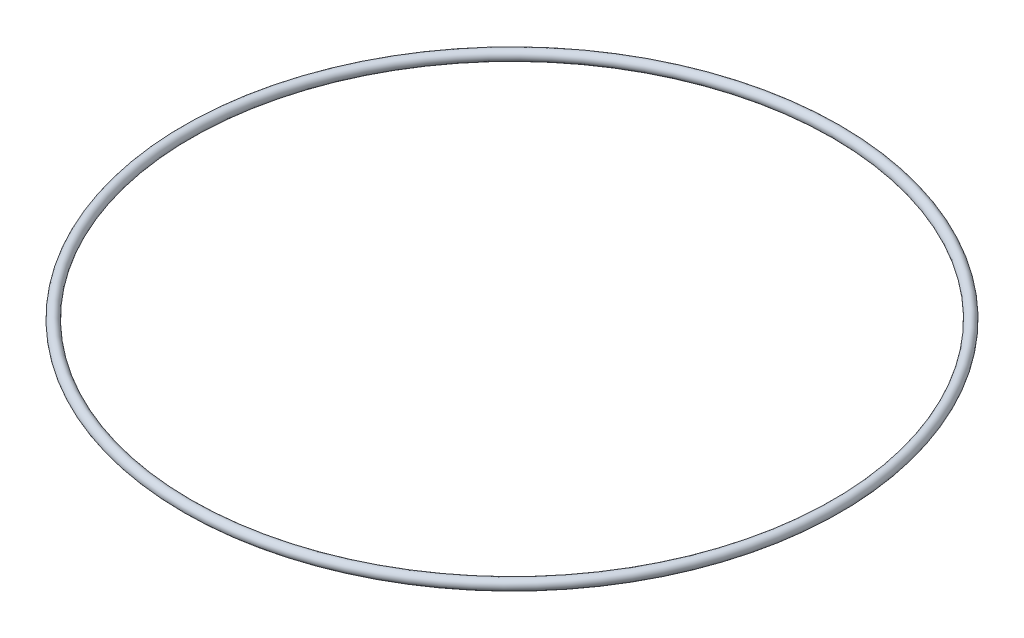
ISO-10303-21;
HEADER;
FILE_DESCRIPTION(('STEP AP214'),'2;1');
FILE_NAME('part.step','',(''),(''),'','','');
FILE_SCHEMA(('AUTOMOTIVE_DESIGN { 1 0 10303 214 1 1 1 1 }'));
ENDSEC;
DATA;
#1=APPLICATION_CONTEXT('core data for automotive mechanical design processes');
#2=APPLICATION_PROTOCOL_DEFINITION('international standard','automotive_design',2000,#1);
#3=PRODUCT_CONTEXT('',#1,'mechanical');
#4=PRODUCT('Part','Part','',(#3));
#5=PRODUCT_RELATED_PRODUCT_CATEGORY('part','',(#4));
#6=PRODUCT_DEFINITION_FORMATION('','',#4);
#7=PRODUCT_DEFINITION_CONTEXT('part definition',#1,'design');
#8=PRODUCT_DEFINITION('design','',#6,#7);
#9=PRODUCT_DEFINITION_SHAPE('','',#8);
#10=(LENGTH_UNIT() NAMED_UNIT(*) SI_UNIT(.MILLI.,.METRE.));
#11=(NAMED_UNIT(*) PLANE_ANGLE_UNIT() SI_UNIT($,.RADIAN.));
#12=(NAMED_UNIT(*) SI_UNIT($,.STERADIAN.) SOLID_ANGLE_UNIT());
#13=UNCERTAINTY_MEASURE_WITH_UNIT(LENGTH_MEASURE(1.E-05),#10,'distance_accuracy_value','');
#14=(GEOMETRIC_REPRESENTATION_CONTEXT(3) GLOBAL_UNCERTAINTY_ASSIGNED_CONTEXT((#13)) GLOBAL_UNIT_ASSIGNED_CONTEXT((#10,
#11,#12)) REPRESENTATION_CONTEXT('',''));
#15=CARTESIAN_POINT('',(0.,0.,0.));
#16=DIRECTION('',(0.,0.,1.));
#17=DIRECTION('',(1.,0.,0.));
#18=AXIS2_PLACEMENT_3D('',#15,#16,#17);
#19=CARTESIAN_POINT('',(0.,0.,0.));
#20=DIRECTION('',(0.,1.,0.));
#21=DIRECTION('',(0.,0.,1.));
#22=AXIS2_PLACEMENT_3D('',#19,#20,#21);
#23=TOROIDAL_SURFACE('',#22,63.,1.);
#24=CARTESIAN_POINT('',(0.,0.,63.));
#25=DIRECTION('',(1.,0.,0.));
#26=DIRECTION('',(0.,0.,-1.));
#27=AXIS2_PLACEMENT_3D('',#24,#25,#26);
#28=CIRCLE('',#27,1.);
#29=CARTESIAN_POINT('',(0.,0.,64.));
#30=VERTEX_POINT('',#29);
#31=EDGE_CURVE('E11',#30,#30,#28,.T.);
#32=CARTESIAN_POINT('',(0.,0.,0.));
#33=DIRECTION('',(0.,1.,0.));
#34=DIRECTION('',(0.,0.,1.));
#35=AXIS2_PLACEMENT_3D('',#32,#33,#34);
#36=CIRCLE('',#35,64.);
#37=EDGE_CURVE('',#30,#30,#36,.T.);
#38=ORIENTED_EDGE('',*,*,#31,.T.);
#39=ORIENTED_EDGE('',*,*,#31,.F.);
#40=ORIENTED_EDGE('',*,*,#37,.T.);
#41=ORIENTED_EDGE('',*,*,#37,.F.);
#42=EDGE_LOOP('',(#38,#40,#39,#41));
#43=FACE_BOUND('',#42,.T.);
#44=ADVANCED_FACE('F44',(#43),#23,.T.);
#45=CLOSED_SHELL('',(#44));
#46=MANIFOLD_SOLID_BREP('B2',#45);
#47=ADVANCED_BREP_SHAPE_REPRESENTATION('',(#18,#46),#14);
#48=SHAPE_DEFINITION_REPRESENTATION(#9,#47);
ENDSEC;
END-ISO-10303-21;
